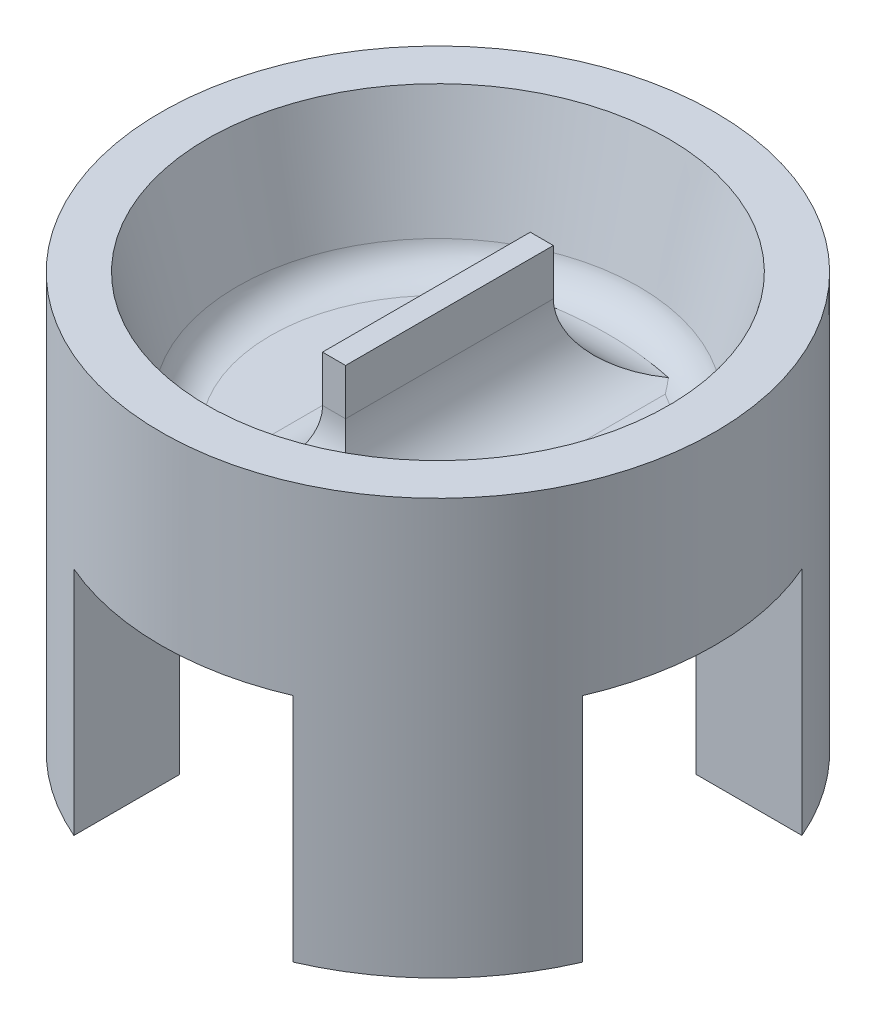
ISO-10303-21;
HEADER;
FILE_DESCRIPTION(('STEP AP214'),'2;1');
FILE_NAME('part.step','',(''),(''),'','','');
FILE_SCHEMA(('AUTOMOTIVE_DESIGN { 1 0 10303 214 1 1 1 1 }'));
ENDSEC;
DATA;
#1=APPLICATION_CONTEXT('core data for automotive mechanical design processes');
#2=APPLICATION_PROTOCOL_DEFINITION('international standard','automotive_design',2000,#1);
#3=PRODUCT_CONTEXT('',#1,'mechanical');
#4=PRODUCT('Part','Part','',(#3));
#5=PRODUCT_RELATED_PRODUCT_CATEGORY('part','',(#4));
#6=PRODUCT_DEFINITION_FORMATION('','',#4);
#7=PRODUCT_DEFINITION_CONTEXT('part definition',#1,'design');
#8=PRODUCT_DEFINITION('design','',#6,#7);
#9=PRODUCT_DEFINITION_SHAPE('','',#8);
#10=(LENGTH_UNIT() NAMED_UNIT(*) SI_UNIT(.MILLI.,.METRE.));
#11=(NAMED_UNIT(*) PLANE_ANGLE_UNIT() SI_UNIT($,.RADIAN.));
#12=(NAMED_UNIT(*) SI_UNIT($,.STERADIAN.) SOLID_ANGLE_UNIT());
#13=UNCERTAINTY_MEASURE_WITH_UNIT(LENGTH_MEASURE(1.E-05),#10,'distance_accuracy_value','');
#14=(GEOMETRIC_REPRESENTATION_CONTEXT(3) GLOBAL_UNCERTAINTY_ASSIGNED_CONTEXT((#13)) GLOBAL_UNIT_ASSIGNED_CONTEXT((#10,
#11,#12)) REPRESENTATION_CONTEXT('',''));
#15=CARTESIAN_POINT('',(0.,0.,0.));
#16=DIRECTION('',(0.,0.,1.));
#17=DIRECTION('',(1.,0.,0.));
#18=AXIS2_PLACEMENT_3D('',#15,#16,#17);
#19=CARTESIAN_POINT('',(0.,1.,0.));
#20=DIRECTION('',(0.,1.,0.));
#21=DIRECTION('',(0.,0.,1.));
#22=AXIS2_PLACEMENT_3D('',#19,#20,#21);
#23=PLANE('',#22);
#24=DIRECTION('',(0.,0.,1.));
#25=VECTOR('',#24,1.);
#26=CARTESIAN_POINT('',(1.75,1.,2.25));
#27=LINE('',#26,#25);
#28=CARTESIAN_POINT('',(1.75,1.,-3.17322598212696));
#29=VERTEX_POINT('',#28);
#30=CARTESIAN_POINT('',(1.75,1.,3.17322598212696));
#31=VERTEX_POINT('',#30);
#32=EDGE_CURVE('E361',#29,#31,#27,.T.);
#33=ORIENTED_EDGE('',*,*,#32,.T.);
#34=CARTESIAN_POINT('',(0.,1.,0.));
#35=DIRECTION('',(0.,1.,0.));
#36=DIRECTION('',(0.,0.,1.));
#37=AXIS2_PLACEMENT_3D('',#34,#35,#36);
#38=CIRCLE('',#37,3.623791265187);
#39=EDGE_CURVE('E389',#31,#29,#38,.T.);
#40=ORIENTED_EDGE('',*,*,#39,.T.);
#41=EDGE_LOOP('',(#33,#40));
#42=FACE_BOUND('',#41,.T.);
#43=ADVANCED_FACE('F39',(#42),#23,.T.);
#44=DIRECTION('',(0.,0.,-1.));
#45=VECTOR('',#44,1.);
#46=CARTESIAN_POINT('',(-1.75,1.,-2.25));
#47=LINE('',#46,#45);
#48=CARTESIAN_POINT('',(-1.75,1.,3.17322598212696));
#49=VERTEX_POINT('',#48);
#50=CARTESIAN_POINT('',(-1.75,1.,-3.17322598212696));
#51=VERTEX_POINT('',#50);
#52=EDGE_CURVE('E364',#49,#51,#47,.T.);
#53=ORIENTED_EDGE('',*,*,#52,.T.);
#54=CARTESIAN_POINT('',(0.,1.,0.));
#55=DIRECTION('',(0.,1.,0.));
#56=DIRECTION('',(0.,0.,1.));
#57=AXIS2_PLACEMENT_3D('',#54,#55,#56);
#58=CIRCLE('',#57,3.623791265187);
#59=EDGE_CURVE('E387',#51,#49,#58,.T.);
#60=ORIENTED_EDGE('',*,*,#59,.T.);
#61=EDGE_LOOP('',(#53,#60));
#62=FACE_BOUND('',#61,.T.);
#63=ADVANCED_FACE('F438',(#62),#23,.T.);
#64=CARTESIAN_POINT('',(0.25,3.5,0.));
#65=DIRECTION('',(1.,0.,0.));
#66=DIRECTION('',(0.,0.,-1.));
#67=AXIS2_PLACEMENT_3D('',#64,#65,#66);
#68=PLANE('',#67);
#69=DIRECTION('',(0.,-1.,0.));
#70=VECTOR('',#69,1.);
#71=CARTESIAN_POINT('',(0.25,3.5,2.25));
#72=LINE('',#71,#70);
#73=CARTESIAN_POINT('',(0.25,3.5,2.25));
#74=VERTEX_POINT('',#73);
#75=CARTESIAN_POINT('',(0.25,2.5,2.25));
#76=VERTEX_POINT('',#75);
#77=EDGE_CURVE('E207',#74,#76,#72,.T.);
#78=ORIENTED_EDGE('',*,*,#77,.T.);
#79=DIRECTION('',(0.,0.,1.));
#80=VECTOR('',#79,1.);
#81=CARTESIAN_POINT('',(0.25,2.5,-2.25));
#82=LINE('',#81,#80);
#83=CARTESIAN_POINT('',(0.25,2.5,-2.25));
#84=VERTEX_POINT('',#83);
#85=EDGE_CURVE('E370',#76,#84,#82,.F.);
#86=ORIENTED_EDGE('',*,*,#85,.T.);
#87=DIRECTION('',(0.,-1.,0.));
#88=VECTOR('',#87,1.);
#89=CARTESIAN_POINT('',(0.25,3.5,-2.25));
#90=LINE('',#89,#88);
#91=CARTESIAN_POINT('',(0.25,3.5,-2.25));
#92=VERTEX_POINT('',#91);
#93=EDGE_CURVE('E233',#92,#84,#90,.T.);
#94=ORIENTED_EDGE('',*,*,#93,.F.);
#95=DIRECTION('',(0.,0.,1.));
#96=VECTOR('',#95,1.);
#97=CARTESIAN_POINT('',(0.25,3.5,0.));
#98=LINE('',#97,#96);
#99=EDGE_CURVE('E226',#92,#74,#98,.T.);
#100=ORIENTED_EDGE('',*,*,#99,.T.);
#101=EDGE_LOOP('',(#78,#86,#94,#100));
#102=FACE_BOUND('',#101,.T.);
#103=ADVANCED_FACE('F231',(#102),#68,.T.);
#104=CARTESIAN_POINT('',(0.,3.5,-2.25));
#105=DIRECTION('',(0.,0.,-1.));
#106=DIRECTION('',(-1.,0.,0.));
#107=AXIS2_PLACEMENT_3D('',#104,#105,#106);
#108=PLANE('',#107);
#109=ORIENTED_EDGE('',*,*,#93,.T.);
#110=DIRECTION('',(1.,0.,0.));
#111=VECTOR('',#110,1.);
#112=CARTESIAN_POINT('',(-1.75,2.5,-2.25));
#113=LINE('',#112,#111);
#114=CARTESIAN_POINT('',(-0.25,2.5,-2.25));
#115=VERTEX_POINT('',#114);
#116=EDGE_CURVE('E372',#84,#115,#113,.F.);
#117=ORIENTED_EDGE('',*,*,#116,.T.);
#118=DIRECTION('',(0.,-1.,0.));
#119=VECTOR('',#118,1.);
#120=CARTESIAN_POINT('',(-0.25,3.5,-2.25));
#121=LINE('',#120,#119);
#122=CARTESIAN_POINT('',(-0.25,3.5,-2.25));
#123=VERTEX_POINT('',#122);
#124=EDGE_CURVE('E245',#123,#115,#121,.T.);
#125=ORIENTED_EDGE('',*,*,#124,.F.);
#126=DIRECTION('',(1.,0.,0.));
#127=VECTOR('',#126,1.);
#128=CARTESIAN_POINT('',(0.,3.5,-2.25));
#129=LINE('',#128,#127);
#130=EDGE_CURVE('E219',#123,#92,#129,.T.);
#131=ORIENTED_EDGE('',*,*,#130,.T.);
#132=EDGE_LOOP('',(#109,#117,#125,#131));
#133=FACE_BOUND('',#132,.T.);
#134=ADVANCED_FACE('F448',(#133),#108,.T.);
#135=CARTESIAN_POINT('',(-0.25,3.5,0.));
#136=DIRECTION('',(-1.,0.,0.));
#137=DIRECTION('',(0.,0.,1.));
#138=AXIS2_PLACEMENT_3D('',#135,#136,#137);
#139=PLANE('',#138);
#140=ORIENTED_EDGE('',*,*,#124,.T.);
#141=DIRECTION('',(0.,0.,-1.));
#142=VECTOR('',#141,1.);
#143=CARTESIAN_POINT('',(-0.25,2.5,2.25));
#144=LINE('',#143,#142);
#145=CARTESIAN_POINT('',(-0.25,2.5,2.25));
#146=VERTEX_POINT('',#145);
#147=EDGE_CURVE('E367',#115,#146,#144,.F.);
#148=ORIENTED_EDGE('',*,*,#147,.T.);
#149=DIRECTION('',(0.,-1.,0.));
#150=VECTOR('',#149,1.);
#151=CARTESIAN_POINT('',(-0.25,3.5,2.25));
#152=LINE('',#151,#150);
#153=CARTESIAN_POINT('',(-0.25,3.5,2.25));
#154=VERTEX_POINT('',#153);
#155=EDGE_CURVE('E218',#154,#146,#152,.T.);
#156=ORIENTED_EDGE('',*,*,#155,.F.);
#157=DIRECTION('',(0.,0.,-1.));
#158=VECTOR('',#157,1.);
#159=CARTESIAN_POINT('',(-0.25,3.5,0.));
#160=LINE('',#159,#158);
#161=EDGE_CURVE('E229',#154,#123,#160,.T.);
#162=ORIENTED_EDGE('',*,*,#161,.T.);
#163=EDGE_LOOP('',(#140,#148,#156,#162));
#164=FACE_BOUND('',#163,.T.);
#165=ADVANCED_FACE('F504',(#164),#139,.T.);
#166=CARTESIAN_POINT('',(0.,3.5,2.25));
#167=DIRECTION('',(0.,0.,1.));
#168=DIRECTION('',(1.,0.,0.));
#169=AXIS2_PLACEMENT_3D('',#166,#167,#168);
#170=PLANE('',#169);
#171=ORIENTED_EDGE('',*,*,#155,.T.);
#172=DIRECTION('',(-1.,0.,0.));
#173=VECTOR('',#172,1.);
#174=CARTESIAN_POINT('',(1.75,2.5,2.25));
#175=LINE('',#174,#173);
#176=EDGE_CURVE('E213',#146,#76,#175,.F.);
#177=ORIENTED_EDGE('',*,*,#176,.T.);
#178=ORIENTED_EDGE('',*,*,#77,.F.);
#179=DIRECTION('',(-1.,0.,0.));
#180=VECTOR('',#179,1.);
#181=CARTESIAN_POINT('',(0.,3.5,2.25));
#182=LINE('',#181,#180);
#183=EDGE_CURVE('E211',#74,#154,#182,.T.);
#184=ORIENTED_EDGE('',*,*,#183,.T.);
#185=EDGE_LOOP('',(#171,#177,#178,#184));
#186=FACE_BOUND('',#185,.T.);
#187=ADVANCED_FACE('F210',(#186),#170,.T.);
#188=CARTESIAN_POINT('',(0.,3.5,0.));
#189=DIRECTION('',(0.,-1.,0.));
#190=DIRECTION('',(0.,0.,-1.));
#191=AXIS2_PLACEMENT_3D('',#188,#189,#190);
#192=PLANE('',#191);
#193=ORIENTED_EDGE('',*,*,#99,.F.);
#194=ORIENTED_EDGE('',*,*,#130,.F.);
#195=ORIENTED_EDGE('',*,*,#161,.F.);
#196=ORIENTED_EDGE('',*,*,#183,.F.);
#197=EDGE_LOOP('',(#193,#194,#195,#196));
#198=FACE_BOUND('',#197,.T.);
#199=ADVANCED_FACE('F224',(#198),#192,.F.);
#200=CARTESIAN_POINT('',(-1.75,2.5,0.));
#201=DIRECTION('',(0.,0.,1.));
#202=DIRECTION('',(1.,0.,0.));
#203=AXIS2_PLACEMENT_3D('',#200,#201,#202);
#204=CYLINDRICAL_SURFACE('',#203,1.5);
#205=CARTESIAN_POINT('',(-1.75,2.5,-3.75));
#206=DIRECTION('',(-0.707106781186547,0.,0.707106781186547));
#207=DIRECTION('',(0.707106781186547,0.,0.707106781186547));
#208=AXIS2_PLACEMENT_3D('',#205,#206,#207);
#209=ELLIPSE('',#208,2.12132034355964,1.5);
#210=CARTESIAN_POINT('',(-1.49605326697927,1.02165259266027,-3.49605326697927));
#211=VERTEX_POINT('',#210);
#212=EDGE_CURVE('E377',#115,#211,#209,.F.);
#213=ORIENTED_EDGE('',*,*,#212,.T.);
#214=CARTESIAN_POINT('',(-1.49605326697927,1.02165259266027,-3.49605326697927));
#215=CARTESIAN_POINT('',(-1.53908933126394,1.01427018335894,-3.44489890433631));
#216=CARTESIAN_POINT('',(-1.58141630981375,1.00892279144213,-3.39287521979692));
#217=CARTESIAN_POINT('',(-1.66443352390068,1.00186198080539,-3.28745021497996));
#218=CARTESIAN_POINT('',(-1.70512666962131,1.00014179139679,-3.23405165013105));
#219=CARTESIAN_POINT('',(-1.74665022550539,1.00000280983622,-3.17777520763984));
#220=CARTESIAN_POINT('',(-1.74832586538904,1.00000000753565,-3.17550112580324));
#221=CARTESIAN_POINT('',(-1.75,1.,-3.17322598212696));
#222=B_SPLINE_CURVE_WITH_KNOTS('',3,(#214,#215,#216,#217,#218,#219,#220,#221),.UNSPECIFIED.,.F.,
.F.,(4,2,2,4),(0.,0.201712666102183,0.403048472327065,0.411522718053596),.UNSPECIFIED.);
#223=EDGE_CURVE('E52',#211,#51,#222,.T.);
#224=ORIENTED_EDGE('',*,*,#223,.T.);
#225=ORIENTED_EDGE('',*,*,#52,.F.);
#226=CARTESIAN_POINT('',(-1.49605326697927,1.02165259266027,3.49605326697927));
#227=CARTESIAN_POINT('',(-1.53908933126391,1.01427018335894,3.44489890433629));
#228=CARTESIAN_POINT('',(-1.58141630981374,1.00892279144214,3.39287521979691));
#229=CARTESIAN_POINT('',(-1.6644335239007,1.00186198080539,3.28745021497997));
#230=CARTESIAN_POINT('',(-1.70512666962134,1.00014179139679,3.23405165013107));
#231=CARTESIAN_POINT('',(-1.74665022550539,1.00000280983622,3.17777520763984));
#232=CARTESIAN_POINT('',(-1.74832586538904,1.00000000753565,3.17550112580324));
#233=CARTESIAN_POINT('',(-1.75,1.,3.17322598212696));
#234=B_SPLINE_CURVE_WITH_KNOTS('',3,(#226,#227,#228,#229,#230,#231,#232,#233),.UNSPECIFIED.,.F.,
.F.,(4,2,2,4),(0.,0.201712666102185,0.403048472327064,0.411522718053597),.UNSPECIFIED.);
#235=CARTESIAN_POINT('',(-1.49605326697927,1.02165259266027,3.49605326697927));
#236=VERTEX_POINT('',#235);
#237=EDGE_CURVE('E59',#49,#236,#234,.F.);
#238=ORIENTED_EDGE('',*,*,#237,.T.);
#239=CARTESIAN_POINT('',(-1.75,2.5,3.75));
#240=DIRECTION('',(0.707106781186547,0.,0.707106781186547));
#241=DIRECTION('',(-0.707106781186547,0.,0.707106781186547));
#242=AXIS2_PLACEMENT_3D('',#239,#240,#241);
#243=ELLIPSE('',#242,2.12132034355964,1.5);
#244=EDGE_CURVE('E379',#236,#146,#243,.T.);
#245=ORIENTED_EDGE('',*,*,#244,.T.);
#246=ORIENTED_EDGE('',*,*,#147,.F.);
#247=EDGE_LOOP('',(#213,#224,#225,#238,#245,#246));
#248=FACE_BOUND('',#247,.T.);
#249=ADVANCED_FACE('F411',(#248),#204,.F.);
#250=CARTESIAN_POINT('',(1.75,2.5,0.));
#251=DIRECTION('',(0.,0.,-1.));
#252=DIRECTION('',(-1.,0.,0.));
#253=AXIS2_PLACEMENT_3D('',#250,#251,#252);
#254=CYLINDRICAL_SURFACE('',#253,1.5);
#255=ORIENTED_EDGE('',*,*,#32,.F.);
#256=CARTESIAN_POINT('',(1.49605326697927,1.02165259266027,-3.49605326697927));
#257=CARTESIAN_POINT('',(1.53908933126391,1.01427018335894,-3.44489890433629));
#258=CARTESIAN_POINT('',(1.58141630981374,1.00892279144214,-3.39287521979691));
#259=CARTESIAN_POINT('',(1.6644335239007,1.00186198080539,-3.28745021497997));
#260=CARTESIAN_POINT('',(1.70512666962134,1.00014179139679,-3.23405165013107));
#261=CARTESIAN_POINT('',(1.74665022550539,1.00000280983622,-3.17777520763984));
#262=CARTESIAN_POINT('',(1.74832586538904,1.00000000753565,-3.17550112580324));
#263=CARTESIAN_POINT('',(1.75,1.,-3.17322598212696));
#264=B_SPLINE_CURVE_WITH_KNOTS('',3,(#256,#257,#258,#259,#260,#261,#262,#263),.UNSPECIFIED.,.F.,
.F.,(4,2,2,4),(0.,0.201712666102185,0.403048472327064,0.411522718053597),.UNSPECIFIED.);
#265=CARTESIAN_POINT('',(1.49605326697927,1.02165259266027,-3.49605326697927));
#266=VERTEX_POINT('',#265);
#267=EDGE_CURVE('E399',#29,#266,#264,.F.);
#268=ORIENTED_EDGE('',*,*,#267,.T.);
#269=CARTESIAN_POINT('',(1.75,2.5,-3.75));
#270=DIRECTION('',(-0.707106781186547,0.,-0.707106781186547));
#271=DIRECTION('',(0.707106781186547,0.,-0.707106781186547));
#272=AXIS2_PLACEMENT_3D('',#269,#270,#271);
#273=ELLIPSE('',#272,2.12132034355964,1.5);
#274=EDGE_CURVE('E375',#266,#84,#273,.T.);
#275=ORIENTED_EDGE('',*,*,#274,.T.);
#276=ORIENTED_EDGE('',*,*,#85,.F.);
#277=CARTESIAN_POINT('',(1.75,2.5,3.75));
#278=DIRECTION('',(0.707106781186547,0.,-0.707106781186547));
#279=DIRECTION('',(-0.707106781186547,0.,-0.707106781186547));
#280=AXIS2_PLACEMENT_3D('',#277,#278,#279);
#281=ELLIPSE('',#280,2.12132034355964,1.5);
#282=CARTESIAN_POINT('',(1.49605326697927,1.02165259266027,3.49605326697927));
#283=VERTEX_POINT('',#282);
#284=EDGE_CURVE('E381',#76,#283,#281,.F.);
#285=ORIENTED_EDGE('',*,*,#284,.T.);
#286=CARTESIAN_POINT('',(1.49605326697927,1.02165259266027,3.49605326697927));
#287=CARTESIAN_POINT('',(1.53908933126394,1.01427018335894,3.44489890433631));
#288=CARTESIAN_POINT('',(1.58141630981375,1.00892279144213,3.39287521979692));
#289=CARTESIAN_POINT('',(1.66443352390068,1.00186198080539,3.28745021497996));
#290=CARTESIAN_POINT('',(1.70512666962131,1.00014179139679,3.23405165013105));
#291=CARTESIAN_POINT('',(1.74665022550539,1.00000280983622,3.17777520763984));
#292=CARTESIAN_POINT('',(1.74832586538904,1.00000000753565,3.17550112580324));
#293=CARTESIAN_POINT('',(1.75,1.,3.17322598212696));
#294=B_SPLINE_CURVE_WITH_KNOTS('',3,(#286,#287,#288,#289,#290,#291,#292,#293),.UNSPECIFIED.,.F.,
.F.,(4,2,2,4),(0.,0.201712666102183,0.403048472327065,0.411522718053596),.UNSPECIFIED.);
#295=EDGE_CURVE('E392',#283,#31,#294,.T.);
#296=ORIENTED_EDGE('',*,*,#295,.T.);
#297=EDGE_LOOP('',(#255,#268,#275,#276,#285,#296));
#298=FACE_BOUND('',#297,.T.);
#299=ADVANCED_FACE('F405',(#298),#254,.F.);
#300=CARTESIAN_POINT('',(0.,2.5,-3.75));
#301=DIRECTION('',(-1.,0.,0.));
#302=DIRECTION('',(0.,0.,1.));
#303=AXIS2_PLACEMENT_3D('',#300,#301,#302);
#304=CYLINDRICAL_SURFACE('',#303,1.5);
#305=ORIENTED_EDGE('',*,*,#274,.F.);
#306=CARTESIAN_POINT('',(1.49605326697927,1.02165259266027,-3.49605326697927));
#307=CARTESIAN_POINT('',(1.3827723803451,1.01696830888682,-3.523589809499));
#308=CARTESIAN_POINT('',(1.26869917591475,1.01351420898775,-3.54804714692911));
#309=CARTESIAN_POINT('',(1.03939449670008,1.00831875589812,-3.5906758400532));
#310=CARTESIAN_POINT('',(0.924163535937596,1.00657667384445,-3.60884986862348));
#311=CARTESIAN_POINT('',(0.712920486420398,1.00427350203379,-3.63621130607991));
#312=CARTESIAN_POINT('',(0.617039660709062,1.00356003336105,-3.64641042982602));
#313=CARTESIAN_POINT('',(0.424892615545098,1.00253839937794,-3.66240011999431));
#314=CARTESIAN_POINT('',(0.328626325430665,1.00223031214573,-3.6681898370558));
#315=CARTESIAN_POINT('',(0.0874112928485685,1.00175882994414,-3.67712324169602));
#316=CARTESIAN_POINT('',(-0.0576509521793053,1.0017463294534,-3.67746804371406));
#317=CARTESIAN_POINT('',(-0.34749736383111,1.00223076941073,-3.66810795105502));
#318=CARTESIAN_POINT('',(-0.492281390274639,1.00272792101619,-3.65839889087778));
#319=CARTESIAN_POINT('',(-0.781336826327782,1.00481632883575,-3.62897796421589));
#320=CARTESIAN_POINT('',(-0.925604806420446,1.00641130866059,-3.60923211477089));
#321=CARTESIAN_POINT('',(-1.14065906515106,1.01051765185565,-3.57225786607192));
#322=CARTESIAN_POINT('',(-1.21211205850882,1.01217182518419,-3.558708941944));
#323=CARTESIAN_POINT('',(-1.35449540549986,1.0162675793777,-3.52918958090675));
#324=CARTESIAN_POINT('',(-1.42542574239033,1.01870918535617,-3.51321906677454));
#325=CARTESIAN_POINT('',(-1.49605326697927,1.02165259266027,-3.49605326697927));
#326=B_SPLINE_CURVE_WITH_KNOTS('',3,(#306,#307,#308,#309,#310,#311,#312,#313,#314,#315,#316,
#317,#318,#319,#320,#321,#322,#323,#324,#325),.UNSPECIFIED.,.F.,.F.,(4,2,2,2,2,2,2,2,2,4),(0.,
0.349964486039017,0.699779915890079,0.988952504155252,1.27818078012857,1.71299609600624,
2.14799163598045,2.58446991050861,2.8026650244955,3.0208670980412),.UNSPECIFIED.);
#327=EDGE_CURVE('E67',#266,#211,#326,.T.);
#328=ORIENTED_EDGE('',*,*,#327,.T.);
#329=ORIENTED_EDGE('',*,*,#212,.F.);
#330=ORIENTED_EDGE('',*,*,#116,.F.);
#331=EDGE_LOOP('',(#305,#328,#329,#330));
#332=FACE_BOUND('',#331,.T.);
#333=ADVANCED_FACE('F410',(#332),#304,.F.);
#334=CARTESIAN_POINT('',(0.,2.5,3.75));
#335=DIRECTION('',(1.,0.,0.));
#336=DIRECTION('',(0.,0.,-1.));
#337=AXIS2_PLACEMENT_3D('',#334,#335,#336);
#338=CYLINDRICAL_SURFACE('',#337,1.5);
#339=ORIENTED_EDGE('',*,*,#244,.F.);
#340=CARTESIAN_POINT('',(-1.49605326697927,1.02165259266027,3.49605326697927));
#341=CARTESIAN_POINT('',(-1.3827723803451,1.01696830888682,3.523589809499));
#342=CARTESIAN_POINT('',(-1.26869917591475,1.01351420898775,3.54804714692911));
#343=CARTESIAN_POINT('',(-1.03939449670008,1.00831875589812,3.5906758400532));
#344=CARTESIAN_POINT('',(-0.924163535937596,1.00657667384445,3.60884986862348));
#345=CARTESIAN_POINT('',(-0.712920486420398,1.00427350203379,3.63621130607991));
#346=CARTESIAN_POINT('',(-0.617039660709062,1.00356003336105,3.64641042982602));
#347=CARTESIAN_POINT('',(-0.424892615545098,1.00253839937794,3.66240011999431));
#348=CARTESIAN_POINT('',(-0.328626325430665,1.00223031214573,3.6681898370558));
#349=CARTESIAN_POINT('',(-0.0874112928485685,1.00175882994414,3.67712324169602));
#350=CARTESIAN_POINT('',(0.0576509521793053,1.0017463294534,3.67746804371406));
#351=CARTESIAN_POINT('',(0.34749736383111,1.00223076941073,3.66810795105502));
#352=CARTESIAN_POINT('',(0.492281390274639,1.00272792101619,3.65839889087778));
#353=CARTESIAN_POINT('',(0.781336826327782,1.00481632883575,3.62897796421589));
#354=CARTESIAN_POINT('',(0.925604806420446,1.00641130866059,3.60923211477089));
#355=CARTESIAN_POINT('',(1.14065906515106,1.01051765185565,3.57225786607192));
#356=CARTESIAN_POINT('',(1.21211205850882,1.01217182518419,3.558708941944));
#357=CARTESIAN_POINT('',(1.35449540549986,1.0162675793777,3.52918958090675));
#358=CARTESIAN_POINT('',(1.42542574239033,1.01870918535617,3.51321906677454));
#359=CARTESIAN_POINT('',(1.49605326697927,1.02165259266027,3.49605326697927));
#360=B_SPLINE_CURVE_WITH_KNOTS('',3,(#340,#341,#342,#343,#344,#345,#346,#347,#348,#349,#350,
#351,#352,#353,#354,#355,#356,#357,#358,#359),.UNSPECIFIED.,.F.,.F.,(4,2,2,2,2,2,2,2,2,4),(0.,
0.349964486039017,0.699779915890079,0.988952504155252,1.27818078012857,1.71299609600624,
2.14799163598045,2.58446991050861,2.8026650244955,3.0208670980412),.UNSPECIFIED.);
#361=EDGE_CURVE('E11',#236,#283,#360,.T.);
#362=ORIENTED_EDGE('',*,*,#361,.T.);
#363=ORIENTED_EDGE('',*,*,#284,.F.);
#364=ORIENTED_EDGE('',*,*,#176,.F.);
#365=EDGE_LOOP('',(#339,#362,#363,#364));
#366=FACE_BOUND('',#365,.T.);
#367=ADVANCED_FACE('F418',(#366),#338,.F.);
#368=CARTESIAN_POINT('',(0.,4.,6.));
#369=DIRECTION('',(0.,-1.,0.));
#370=DIRECTION('',(0.,0.,-1.));
#371=AXIS2_PLACEMENT_3D('',#368,#369,#370);
#372=PLANE('',#371);
#373=CARTESIAN_POINT('',(0.,4.,0.));
#374=DIRECTION('',(0.,-1.,0.));
#375=DIRECTION('',(0.,0.,-1.));
#376=AXIS2_PLACEMENT_3D('',#373,#374,#375);
#377=CIRCLE('',#376,6.);
#378=CARTESIAN_POINT('',(0.,4.,-6.));
#379=VERTEX_POINT('',#378);
#380=EDGE_CURVE('E234',#379,#379,#377,.T.);
#381=ORIENTED_EDGE('',*,*,#380,.F.);
#382=EDGE_LOOP('',(#381));
#383=FACE_BOUND('',#382,.T.);
#384=CARTESIAN_POINT('',(0.,4.,0.));
#385=DIRECTION('',(0.,-1.,0.));
#386=DIRECTION('',(0.,0.,-1.));
#387=AXIS2_PLACEMENT_3D('',#384,#385,#386);
#388=CIRCLE('',#387,5.);
#389=CARTESIAN_POINT('',(0.,4.,-5.));
#390=VERTEX_POINT('',#389);
#391=EDGE_CURVE('E237',#390,#390,#388,.T.);
#392=ORIENTED_EDGE('',*,*,#391,.T.);
#393=EDGE_LOOP('',(#392));
#394=FACE_BOUND('',#393,.T.);
#395=ADVANCED_FACE('F484',(#383,#394),#372,.F.);
#396=CARTESIAN_POINT('',(0.,1.,0.));
#397=DIRECTION('',(0.,1.,0.));
#398=DIRECTION('',(0.,0.,1.));
#399=AXIS2_PLACEMENT_3D('',#396,#397,#398);
#400=CONICAL_SURFACE('',#399,4.2,0.260602391747341);
#401=CARTESIAN_POINT('',(0.,1.55675301207975,0.));
#402=DIRECTION('',(0.,-1.,0.));
#403=DIRECTION('',(0.,0.,-1.));
#404=AXIS2_PLACEMENT_3D('',#401,#402,#403);
#405=CIRCLE('',#404,4.34846746988793);
#406=CARTESIAN_POINT('',(0.,1.55675301207975,-4.34846746988793));
#407=VERTEX_POINT('',#406);
#408=EDGE_CURVE('E384',#407,#407,#405,.T.);
#409=ORIENTED_EDGE('',*,*,#408,.T.);
#410=EDGE_LOOP('',(#409));
#411=FACE_BOUND('',#410,.T.);
#412=ORIENTED_EDGE('',*,*,#391,.F.);
#413=EDGE_LOOP('',(#412));
#414=FACE_BOUND('',#413,.T.);
#415=ADVANCED_FACE('F487',(#411,#414),#400,.F.);
#416=CARTESIAN_POINT('',(0.,-15.,0.));
#417=DIRECTION('',(0.,1.,0.));
#418=DIRECTION('',(0.,0.,1.));
#419=AXIS2_PLACEMENT_3D('',#416,#417,#418);
#420=CYLINDRICAL_SURFACE('',#419,4.);
#421=DIRECTION('',(0.,1.,0.));
#422=VECTOR('',#421,1.);
#423=CARTESIAN_POINT('',(2.375,-15.,3.21859829739593));
#424=LINE('',#423,#422);
#425=CARTESIAN_POINT('',(2.375,-5.,3.21859829739593));
#426=VERTEX_POINT('',#425);
#427=CARTESIAN_POINT('',(2.375,0.,3.21859829739593));
#428=VERTEX_POINT('',#427);
#429=EDGE_CURVE('E285',#426,#428,#424,.T.);
#430=ORIENTED_EDGE('',*,*,#429,.T.);
#431=CARTESIAN_POINT('',(0.,0.,0.));
#432=DIRECTION('',(0.,1.,0.));
#433=DIRECTION('',(0.,0.,1.));
#434=AXIS2_PLACEMENT_3D('',#431,#432,#433);
#435=CIRCLE('',#434,4.);
#436=CARTESIAN_POINT('',(3.21859829739593,0.,2.375));
#437=VERTEX_POINT('',#436);
#438=EDGE_CURVE('E244',#428,#437,#435,.T.);
#439=ORIENTED_EDGE('',*,*,#438,.T.);
#440=DIRECTION('',(0.,1.,0.));
#441=VECTOR('',#440,1.);
#442=CARTESIAN_POINT('',(3.21859829739593,-15.,2.375));
#443=LINE('',#442,#441);
#444=CARTESIAN_POINT('',(3.21859829739593,-5.,2.375));
#445=VERTEX_POINT('',#444);
#446=EDGE_CURVE('E284',#445,#437,#443,.T.);
#447=ORIENTED_EDGE('',*,*,#446,.F.);
#448=CARTESIAN_POINT('',(0.,-5.,0.));
#449=DIRECTION('',(0.,1.,0.));
#450=DIRECTION('',(0.,0.,1.));
#451=AXIS2_PLACEMENT_3D('',#448,#449,#450);
#452=CIRCLE('',#451,4.);
#453=EDGE_CURVE('E324',#426,#445,#452,.T.);
#454=ORIENTED_EDGE('',*,*,#453,.F.);
#455=EDGE_LOOP('',(#430,#439,#447,#454));
#456=FACE_BOUND('',#455,.T.);
#457=ADVANCED_FACE('F458',(#456),#420,.F.);
#458=CARTESIAN_POINT('',(0.,-15.,0.));
#459=DIRECTION('',(0.,1.,0.));
#460=DIRECTION('',(0.,0.,1.));
#461=AXIS2_PLACEMENT_3D('',#458,#459,#460);
#462=CYLINDRICAL_SURFACE('',#461,4.);
#463=DIRECTION('',(0.,1.,0.));
#464=VECTOR('',#463,1.);
#465=CARTESIAN_POINT('',(3.21859829739593,-15.,-2.375));
#466=LINE('',#465,#464);
#467=CARTESIAN_POINT('',(3.21859829739593,-5.,-2.375));
#468=VERTEX_POINT('',#467);
#469=CARTESIAN_POINT('',(3.21859829739593,0.,-2.375));
#470=VERTEX_POINT('',#469);
#471=EDGE_CURVE('E298',#468,#470,#466,.T.);
#472=ORIENTED_EDGE('',*,*,#471,.T.);
#473=CARTESIAN_POINT('',(0.,0.,0.));
#474=DIRECTION('',(0.,1.,0.));
#475=DIRECTION('',(0.,0.,1.));
#476=AXIS2_PLACEMENT_3D('',#473,#474,#475);
#477=CIRCLE('',#476,4.);
#478=CARTESIAN_POINT('',(2.375,0.,-3.21859829739593));
#479=VERTEX_POINT('',#478);
#480=EDGE_CURVE('E257',#470,#479,#477,.T.);
#481=ORIENTED_EDGE('',*,*,#480,.T.);
#482=DIRECTION('',(0.,1.,0.));
#483=VECTOR('',#482,1.);
#484=CARTESIAN_POINT('',(2.375,-15.,-3.21859829739593));
#485=LINE('',#484,#483);
#486=CARTESIAN_POINT('',(2.375,-5.,-3.21859829739593));
#487=VERTEX_POINT('',#486);
#488=EDGE_CURVE('E296',#487,#479,#485,.T.);
#489=ORIENTED_EDGE('',*,*,#488,.F.);
#490=CARTESIAN_POINT('',(0.,-5.,0.));
#491=DIRECTION('',(0.,1.,0.));
#492=DIRECTION('',(0.,0.,1.));
#493=AXIS2_PLACEMENT_3D('',#490,#491,#492);
#494=CIRCLE('',#493,4.);
#495=EDGE_CURVE('E333',#468,#487,#494,.T.);
#496=ORIENTED_EDGE('',*,*,#495,.F.);
#497=EDGE_LOOP('',(#472,#481,#489,#496));
#498=FACE_BOUND('',#497,.T.);
#499=ADVANCED_FACE('F497',(#498),#462,.F.);
#500=CARTESIAN_POINT('',(0.,-15.,0.));
#501=DIRECTION('',(0.,1.,0.));
#502=DIRECTION('',(0.,0.,1.));
#503=AXIS2_PLACEMENT_3D('',#500,#501,#502);
#504=CYLINDRICAL_SURFACE('',#503,4.);
#505=DIRECTION('',(0.,1.,0.));
#506=VECTOR('',#505,1.);
#507=CARTESIAN_POINT('',(-2.375,-15.,-3.21859829739593));
#508=LINE('',#507,#506);
#509=CARTESIAN_POINT('',(-2.375,-5.,-3.21859829739593));
#510=VERTEX_POINT('',#509);
#511=CARTESIAN_POINT('',(-2.375,0.,-3.21859829739593));
#512=VERTEX_POINT('',#511);
#513=EDGE_CURVE('E294',#510,#512,#508,.T.);
#514=ORIENTED_EDGE('',*,*,#513,.T.);
#515=CARTESIAN_POINT('',(0.,0.,0.));
#516=DIRECTION('',(0.,1.,0.));
#517=DIRECTION('',(0.,0.,1.));
#518=AXIS2_PLACEMENT_3D('',#515,#516,#517);
#519=CIRCLE('',#518,4.);
#520=CARTESIAN_POINT('',(-3.21859829739593,0.,-2.375));
#521=VERTEX_POINT('',#520);
#522=EDGE_CURVE('E266',#512,#521,#519,.T.);
#523=ORIENTED_EDGE('',*,*,#522,.T.);
#524=DIRECTION('',(0.,1.,0.));
#525=VECTOR('',#524,1.);
#526=CARTESIAN_POINT('',(-3.21859829739593,-15.,-2.375));
#527=LINE('',#526,#525);
#528=CARTESIAN_POINT('',(-3.21859829739593,-5.,-2.375));
#529=VERTEX_POINT('',#528);
#530=EDGE_CURVE('E292',#529,#521,#527,.T.);
#531=ORIENTED_EDGE('',*,*,#530,.F.);
#532=CARTESIAN_POINT('',(0.,-5.,0.));
#533=DIRECTION('',(0.,1.,0.));
#534=DIRECTION('',(0.,0.,1.));
#535=AXIS2_PLACEMENT_3D('',#532,#533,#534);
#536=CIRCLE('',#535,4.);
#537=EDGE_CURVE('E342',#510,#529,#536,.T.);
#538=ORIENTED_EDGE('',*,*,#537,.F.);
#539=EDGE_LOOP('',(#514,#523,#531,#538));
#540=FACE_BOUND('',#539,.T.);
#541=ADVANCED_FACE('F526',(#540),#504,.F.);
#542=CARTESIAN_POINT('',(0.,-15.,0.));
#543=DIRECTION('',(0.,1.,0.));
#544=DIRECTION('',(0.,0.,1.));
#545=AXIS2_PLACEMENT_3D('',#542,#543,#544);
#546=CYLINDRICAL_SURFACE('',#545,4.);
#547=DIRECTION('',(0.,1.,0.));
#548=VECTOR('',#547,1.);
#549=CARTESIAN_POINT('',(-3.21859829739593,-15.,2.375));
#550=LINE('',#549,#548);
#551=CARTESIAN_POINT('',(-3.21859829739593,-5.,2.375));
#552=VERTEX_POINT('',#551);
#553=CARTESIAN_POINT('',(-3.21859829739593,0.,2.375));
#554=VERTEX_POINT('',#553);
#555=EDGE_CURVE('E290',#552,#554,#550,.T.);
#556=ORIENTED_EDGE('',*,*,#555,.T.);
#557=CARTESIAN_POINT('',(0.,0.,0.));
#558=DIRECTION('',(0.,1.,0.));
#559=DIRECTION('',(0.,0.,1.));
#560=AXIS2_PLACEMENT_3D('',#557,#558,#559);
#561=CIRCLE('',#560,4.);
#562=CARTESIAN_POINT('',(-2.375,0.,3.21859829739593));
#563=VERTEX_POINT('',#562);
#564=EDGE_CURVE('E275',#554,#563,#561,.T.);
#565=ORIENTED_EDGE('',*,*,#564,.T.);
#566=DIRECTION('',(0.,1.,0.));
#567=VECTOR('',#566,1.);
#568=CARTESIAN_POINT('',(-2.375,-15.,3.21859829739593));
#569=LINE('',#568,#567);
#570=CARTESIAN_POINT('',(-2.375,-5.,3.21859829739593));
#571=VERTEX_POINT('',#570);
#572=EDGE_CURVE('E288',#571,#563,#569,.T.);
#573=ORIENTED_EDGE('',*,*,#572,.F.);
#574=CARTESIAN_POINT('',(0.,-5.,0.));
#575=DIRECTION('',(0.,1.,0.));
#576=DIRECTION('',(0.,0.,1.));
#577=AXIS2_PLACEMENT_3D('',#574,#575,#576);
#578=CIRCLE('',#577,4.);
#579=EDGE_CURVE('E351',#552,#571,#578,.T.);
#580=ORIENTED_EDGE('',*,*,#579,.F.);
#581=EDGE_LOOP('',(#556,#565,#573,#580));
#582=FACE_BOUND('',#581,.T.);
#583=ADVANCED_FACE('F523',(#582),#546,.F.);
#584=CARTESIAN_POINT('',(-10.,-15.,-2.375));
#585=DIRECTION('',(0.,0.,-1.));
#586=DIRECTION('',(-1.,0.,0.));
#587=AXIS2_PLACEMENT_3D('',#584,#585,#586);
#588=PLANE('',#587);
#589=DIRECTION('',(0.,1.,0.));
#590=VECTOR('',#589,1.);
#591=CARTESIAN_POINT('',(-5.50993421013355,-5.,-2.375));
#592=LINE('',#591,#590);
#593=CARTESIAN_POINT('',(-5.50993421013355,0.,-2.375));
#594=VERTEX_POINT('',#593);
#595=CARTESIAN_POINT('',(-5.50993421013355,-5.,-2.375));
#596=VERTEX_POINT('',#595);
#597=EDGE_CURVE('E308',#594,#596,#592,.F.);
#598=ORIENTED_EDGE('',*,*,#597,.T.);
#599=DIRECTION('',(-1.,0.,0.));
#600=VECTOR('',#599,1.);
#601=CARTESIAN_POINT('',(0.,-5.,-2.375));
#602=LINE('',#601,#600);
#603=EDGE_CURVE('E345',#529,#596,#602,.T.);
#604=ORIENTED_EDGE('',*,*,#603,.F.);
#605=ORIENTED_EDGE('',*,*,#530,.T.);
#606=DIRECTION('',(-1.,0.,0.));
#607=VECTOR('',#606,1.);
#608=CARTESIAN_POINT('',(-10.,0.,-2.375));
#609=LINE('',#608,#607);
#610=EDGE_CURVE('E269',#521,#594,#609,.T.);
#611=ORIENTED_EDGE('',*,*,#610,.T.);
#612=EDGE_LOOP('',(#598,#604,#605,#611));
#613=FACE_BOUND('',#612,.T.);
#614=ADVANCED_FACE('F525',(#613),#588,.F.);
#615=CARTESIAN_POINT('',(0.,-5.,0.));
#616=DIRECTION('',(0.,1.,0.));
#617=DIRECTION('',(0.,0.,1.));
#618=AXIS2_PLACEMENT_3D('',#615,#616,#617);
#619=PLANE('',#618);
#620=ORIENTED_EDGE('',*,*,#537,.T.);
#621=ORIENTED_EDGE('',*,*,#603,.T.);
#622=CARTESIAN_POINT('',(0.,-5.,0.));
#623=DIRECTION('',(0.,1.,0.));
#624=DIRECTION('',(0.,0.,1.));
#625=AXIS2_PLACEMENT_3D('',#622,#623,#624);
#626=CIRCLE('',#625,6.);
#627=CARTESIAN_POINT('',(-2.375,-5.,-5.50993421013355));
#628=VERTEX_POINT('',#627);
#629=EDGE_CURVE('E582',#628,#596,#626,.T.);
#630=ORIENTED_EDGE('',*,*,#629,.F.);
#631=DIRECTION('',(0.,0.,1.));
#632=VECTOR('',#631,1.);
#633=CARTESIAN_POINT('',(-2.375,-5.,0.));
#634=LINE('',#633,#632);
#635=EDGE_CURVE('E339',#628,#510,#634,.T.);
#636=ORIENTED_EDGE('',*,*,#635,.T.);
#637=EDGE_LOOP('',(#620,#621,#630,#636));
#638=FACE_BOUND('',#637,.T.);
#639=ADVANCED_FACE('F531',(#638),#619,.F.);
#640=CARTESIAN_POINT('',(-2.375,-15.,-10.));
#641=DIRECTION('',(-1.,0.,0.));
#642=DIRECTION('',(0.,0.,1.));
#643=AXIS2_PLACEMENT_3D('',#640,#641,#642);
#644=PLANE('',#643);
#645=DIRECTION('',(0.,1.,0.));
#646=VECTOR('',#645,1.);
#647=CARTESIAN_POINT('',(-2.375,-5.,-5.50993421013355));
#648=LINE('',#647,#646);
#649=CARTESIAN_POINT('',(-2.375,0.,-5.50993421013355));
#650=VERTEX_POINT('',#649);
#651=EDGE_CURVE('E306',#628,#650,#648,.T.);
#652=ORIENTED_EDGE('',*,*,#651,.T.);
#653=DIRECTION('',(0.,0.,1.));
#654=VECTOR('',#653,1.);
#655=CARTESIAN_POINT('',(-2.375,0.,-10.));
#656=LINE('',#655,#654);
#657=EDGE_CURVE('E263',#650,#512,#656,.T.);
#658=ORIENTED_EDGE('',*,*,#657,.T.);
#659=ORIENTED_EDGE('',*,*,#513,.F.);
#660=ORIENTED_EDGE('',*,*,#635,.F.);
#661=EDGE_LOOP('',(#652,#658,#659,#660));
#662=FACE_BOUND('',#661,.T.);
#663=ADVANCED_FACE('F536',(#662),#644,.F.);
#664=CARTESIAN_POINT('',(2.375,-15.,-10.));
#665=DIRECTION('',(1.,0.,0.));
#666=DIRECTION('',(0.,0.,-1.));
#667=AXIS2_PLACEMENT_3D('',#664,#665,#666);
#668=PLANE('',#667);
#669=DIRECTION('',(0.,1.,0.));
#670=VECTOR('',#669,1.);
#671=CARTESIAN_POINT('',(2.375,-5.,-5.50993421013355));
#672=LINE('',#671,#670);
#673=CARTESIAN_POINT('',(2.375,0.,-5.50993421013355));
#674=VERTEX_POINT('',#673);
#675=CARTESIAN_POINT('',(2.375,-5.,-5.50993421013355));
#676=VERTEX_POINT('',#675);
#677=EDGE_CURVE('E304',#674,#676,#672,.F.);
#678=ORIENTED_EDGE('',*,*,#677,.T.);
#679=DIRECTION('',(0.,0.,-1.));
#680=VECTOR('',#679,1.);
#681=CARTESIAN_POINT('',(2.375,-5.,0.));
#682=LINE('',#681,#680);
#683=EDGE_CURVE('E336',#487,#676,#682,.T.);
#684=ORIENTED_EDGE('',*,*,#683,.F.);
#685=ORIENTED_EDGE('',*,*,#488,.T.);
#686=DIRECTION('',(0.,0.,-1.));
#687=VECTOR('',#686,1.);
#688=CARTESIAN_POINT('',(2.375,0.,-10.));
#689=LINE('',#688,#687);
#690=EDGE_CURVE('E260',#479,#674,#689,.T.);
#691=ORIENTED_EDGE('',*,*,#690,.T.);
#692=EDGE_LOOP('',(#678,#684,#685,#691));
#693=FACE_BOUND('',#692,.T.);
#694=ADVANCED_FACE('F539',(#693),#668,.F.);
#695=ORIENTED_EDGE('',*,*,#495,.T.);
#696=ORIENTED_EDGE('',*,*,#683,.T.);
#697=CARTESIAN_POINT('',(5.50993421013355,-5.,-2.375));
#698=VERTEX_POINT('',#697);
#699=EDGE_CURVE('E321',#698,#676,#626,.T.);
#700=ORIENTED_EDGE('',*,*,#699,.F.);
#701=DIRECTION('',(-1.,0.,0.));
#702=VECTOR('',#701,1.);
#703=CARTESIAN_POINT('',(0.,-5.,-2.375));
#704=LINE('',#703,#702);
#705=EDGE_CURVE('E330',#698,#468,#704,.T.);
#706=ORIENTED_EDGE('',*,*,#705,.T.);
#707=EDGE_LOOP('',(#695,#696,#700,#706));
#708=FACE_BOUND('',#707,.T.);
#709=ADVANCED_FACE('F466',(#708),#619,.F.);
#710=CARTESIAN_POINT('',(3.21859829739593,-15.,-2.375));
#711=DIRECTION('',(0.,0.,-1.));
#712=DIRECTION('',(-1.,0.,0.));
#713=AXIS2_PLACEMENT_3D('',#710,#711,#712);
#714=PLANE('',#713);
#715=DIRECTION('',(0.,1.,0.));
#716=VECTOR('',#715,1.);
#717=CARTESIAN_POINT('',(5.50993421013355,-5.,-2.375));
#718=LINE('',#717,#716);
#719=CARTESIAN_POINT('',(5.50993421013355,0.,-2.375));
#720=VERTEX_POINT('',#719);
#721=EDGE_CURVE('E302',#698,#720,#718,.T.);
#722=ORIENTED_EDGE('',*,*,#721,.T.);
#723=DIRECTION('',(-1.,0.,0.));
#724=VECTOR('',#723,1.);
#725=CARTESIAN_POINT('',(3.21859829739593,0.,-2.375));
#726=LINE('',#725,#724);
#727=EDGE_CURVE('E254',#720,#470,#726,.T.);
#728=ORIENTED_EDGE('',*,*,#727,.T.);
#729=ORIENTED_EDGE('',*,*,#471,.F.);
#730=ORIENTED_EDGE('',*,*,#705,.F.);
#731=EDGE_LOOP('',(#722,#728,#729,#730));
#732=FACE_BOUND('',#731,.T.);
#733=ADVANCED_FACE('F547',(#732),#714,.F.);
#734=CARTESIAN_POINT('',(3.21859829739593,-15.,2.375));
#735=DIRECTION('',(0.,0.,1.));
#736=DIRECTION('',(1.,0.,0.));
#737=AXIS2_PLACEMENT_3D('',#734,#735,#736);
#738=PLANE('',#737);
#739=DIRECTION('',(0.,1.,0.));
#740=VECTOR('',#739,1.);
#741=CARTESIAN_POINT('',(5.50993421013355,-5.,2.375));
#742=LINE('',#741,#740);
#743=CARTESIAN_POINT('',(5.50993421013355,0.,2.375));
#744=VERTEX_POINT('',#743);
#745=CARTESIAN_POINT('',(5.50993421013355,-5.,2.375));
#746=VERTEX_POINT('',#745);
#747=EDGE_CURVE('E287',#744,#746,#742,.F.);
#748=ORIENTED_EDGE('',*,*,#747,.T.);
#749=DIRECTION('',(1.,0.,0.));
#750=VECTOR('',#749,1.);
#751=CARTESIAN_POINT('',(0.,-5.,2.375));
#752=LINE('',#751,#750);
#753=EDGE_CURVE('E320',#445,#746,#752,.T.);
#754=ORIENTED_EDGE('',*,*,#753,.F.);
#755=ORIENTED_EDGE('',*,*,#446,.T.);
#756=DIRECTION('',(1.,0.,0.));
#757=VECTOR('',#756,1.);
#758=CARTESIAN_POINT('',(3.21859829739593,0.,2.375));
#759=LINE('',#758,#757);
#760=EDGE_CURVE('E251',#437,#744,#759,.T.);
#761=ORIENTED_EDGE('',*,*,#760,.T.);
#762=EDGE_LOOP('',(#748,#754,#755,#761));
#763=FACE_BOUND('',#762,.T.);
#764=ADVANCED_FACE('F463',(#763),#738,.F.);
#765=CARTESIAN_POINT('',(2.375,-5.,5.50993421013355));
#766=VERTEX_POINT('',#765);
#767=EDGE_CURVE('E317',#766,#746,#626,.T.);
#768=ORIENTED_EDGE('',*,*,#767,.F.);
#769=DIRECTION('',(0.,0.,-1.));
#770=VECTOR('',#769,1.);
#771=CARTESIAN_POINT('',(2.375,-5.,0.));
#772=LINE('',#771,#770);
#773=EDGE_CURVE('E327',#766,#426,#772,.T.);
#774=ORIENTED_EDGE('',*,*,#773,.T.);
#775=ORIENTED_EDGE('',*,*,#453,.T.);
#776=ORIENTED_EDGE('',*,*,#753,.T.);
#777=EDGE_LOOP('',(#768,#774,#775,#776));
#778=FACE_BOUND('',#777,.T.);
#779=ADVANCED_FACE('F460',(#778),#619,.F.);
#780=CARTESIAN_POINT('',(2.375,-15.,3.21859829739593));
#781=DIRECTION('',(1.,0.,0.));
#782=DIRECTION('',(0.,0.,-1.));
#783=AXIS2_PLACEMENT_3D('',#780,#781,#782);
#784=PLANE('',#783);
#785=DIRECTION('',(0.,1.,0.));
#786=VECTOR('',#785,1.);
#787=CARTESIAN_POINT('',(2.375,-5.,5.50993421013355));
#788=LINE('',#787,#786);
#789=CARTESIAN_POINT('',(2.375,0.,5.50993421013355));
#790=VERTEX_POINT('',#789);
#791=EDGE_CURVE('E314',#766,#790,#788,.T.);
#792=ORIENTED_EDGE('',*,*,#791,.T.);
#793=DIRECTION('',(0.,0.,-1.));
#794=VECTOR('',#793,1.);
#795=CARTESIAN_POINT('',(2.375,0.,3.21859829739593));
#796=LINE('',#795,#794);
#797=EDGE_CURVE('E281',#790,#428,#796,.T.);
#798=ORIENTED_EDGE('',*,*,#797,.T.);
#799=ORIENTED_EDGE('',*,*,#429,.F.);
#800=ORIENTED_EDGE('',*,*,#773,.F.);
#801=EDGE_LOOP('',(#792,#798,#799,#800));
#802=FACE_BOUND('',#801,.T.);
#803=ADVANCED_FACE('F462',(#802),#784,.F.);
#804=CARTESIAN_POINT('',(0.,0.,0.));
#805=DIRECTION('',(0.,1.,0.));
#806=DIRECTION('',(0.,0.,1.));
#807=AXIS2_PLACEMENT_3D('',#804,#805,#806);
#808=PLANE('',#807);
#809=CARTESIAN_POINT('',(0.,0.,0.));
#810=DIRECTION('',(0.,1.,0.));
#811=DIRECTION('',(0.,0.,1.));
#812=AXIS2_PLACEMENT_3D('',#809,#810,#811);
#813=CIRCLE('',#812,6.);
#814=CARTESIAN_POINT('',(-5.50993421013355,0.,2.375));
#815=VERTEX_POINT('',#814);
#816=EDGE_CURVE('E360',#815,#594,#813,.F.);
#817=ORIENTED_EDGE('',*,*,#816,.T.);
#818=ORIENTED_EDGE('',*,*,#610,.F.);
#819=ORIENTED_EDGE('',*,*,#522,.F.);
#820=ORIENTED_EDGE('',*,*,#657,.F.);
#821=EDGE_CURVE('E569',#650,#674,#813,.F.);
#822=ORIENTED_EDGE('',*,*,#821,.T.);
#823=ORIENTED_EDGE('',*,*,#690,.F.);
#824=ORIENTED_EDGE('',*,*,#480,.F.);
#825=ORIENTED_EDGE('',*,*,#727,.F.);
#826=EDGE_CURVE('E359',#720,#744,#813,.F.);
#827=ORIENTED_EDGE('',*,*,#826,.T.);
#828=ORIENTED_EDGE('',*,*,#760,.F.);
#829=ORIENTED_EDGE('',*,*,#438,.F.);
#830=ORIENTED_EDGE('',*,*,#797,.F.);
#831=CARTESIAN_POINT('',(-2.375,0.,5.50993421013355));
#832=VERTEX_POINT('',#831);
#833=EDGE_CURVE('E357',#790,#832,#813,.F.);
#834=ORIENTED_EDGE('',*,*,#833,.T.);
#835=DIRECTION('',(0.,0.,1.));
#836=VECTOR('',#835,1.);
#837=CARTESIAN_POINT('',(-2.375,0.,3.21859829739593));
#838=LINE('',#837,#836);
#839=EDGE_CURVE('E278',#563,#832,#838,.T.);
#840=ORIENTED_EDGE('',*,*,#839,.F.);
#841=ORIENTED_EDGE('',*,*,#564,.F.);
#842=DIRECTION('',(1.,0.,0.));
#843=VECTOR('',#842,1.);
#844=CARTESIAN_POINT('',(-10.,0.,2.375));
#845=LINE('',#844,#843);
#846=EDGE_CURVE('E272',#815,#554,#845,.T.);
#847=ORIENTED_EDGE('',*,*,#846,.F.);
#848=EDGE_LOOP('',(#817,#818,#819,#820,#822,#823,#824,#825,#827,#828,#829,#830,#834,#840,#841,#847));
#849=FACE_BOUND('',#848,.T.);
#850=ADVANCED_FACE('F512',(#849),#808,.F.);
#851=CARTESIAN_POINT('',(-2.375,-15.,3.21859829739593));
#852=DIRECTION('',(-1.,0.,0.));
#853=DIRECTION('',(0.,0.,1.));
#854=AXIS2_PLACEMENT_3D('',#851,#852,#853);
#855=PLANE('',#854);
#856=DIRECTION('',(0.,1.,0.));
#857=VECTOR('',#856,1.);
#858=CARTESIAN_POINT('',(-2.375,-5.,5.50993421013355));
#859=LINE('',#858,#857);
#860=CARTESIAN_POINT('',(-2.375,-5.,5.50993421013355));
#861=VERTEX_POINT('',#860);
#862=EDGE_CURVE('E312',#832,#861,#859,.F.);
#863=ORIENTED_EDGE('',*,*,#862,.T.);
#864=DIRECTION('',(0.,0.,1.));
#865=VECTOR('',#864,1.);
#866=CARTESIAN_POINT('',(-2.375,-5.,0.));
#867=LINE('',#866,#865);
#868=EDGE_CURVE('E354',#571,#861,#867,.T.);
#869=ORIENTED_EDGE('',*,*,#868,.F.);
#870=ORIENTED_EDGE('',*,*,#572,.T.);
#871=ORIENTED_EDGE('',*,*,#839,.T.);
#872=EDGE_LOOP('',(#863,#869,#870,#871));
#873=FACE_BOUND('',#872,.T.);
#874=ADVANCED_FACE('F515',(#873),#855,.F.);
#875=ORIENTED_EDGE('',*,*,#579,.T.);
#876=ORIENTED_EDGE('',*,*,#868,.T.);
#877=CARTESIAN_POINT('',(-5.50993421013355,-5.,2.375));
#878=VERTEX_POINT('',#877);
#879=EDGE_CURVE('E316',#878,#861,#626,.T.);
#880=ORIENTED_EDGE('',*,*,#879,.F.);
#881=DIRECTION('',(1.,0.,0.));
#882=VECTOR('',#881,1.);
#883=CARTESIAN_POINT('',(0.,-5.,2.375));
#884=LINE('',#883,#882);
#885=EDGE_CURVE('E348',#878,#552,#884,.T.);
#886=ORIENTED_EDGE('',*,*,#885,.T.);
#887=EDGE_LOOP('',(#875,#876,#880,#886));
#888=FACE_BOUND('',#887,.T.);
#889=ADVANCED_FACE('F465',(#888),#619,.F.);
#890=CARTESIAN_POINT('',(-10.,-15.,2.375));
#891=DIRECTION('',(0.,0.,1.));
#892=DIRECTION('',(1.,0.,0.));
#893=AXIS2_PLACEMENT_3D('',#890,#891,#892);
#894=PLANE('',#893);
#895=DIRECTION('',(0.,1.,0.));
#896=VECTOR('',#895,1.);
#897=CARTESIAN_POINT('',(-5.50993421013355,-5.,2.375));
#898=LINE('',#897,#896);
#899=EDGE_CURVE('E310',#878,#815,#898,.T.);
#900=ORIENTED_EDGE('',*,*,#899,.T.);
#901=ORIENTED_EDGE('',*,*,#846,.T.);
#902=ORIENTED_EDGE('',*,*,#555,.F.);
#903=ORIENTED_EDGE('',*,*,#885,.F.);
#904=EDGE_LOOP('',(#900,#901,#902,#903));
#905=FACE_BOUND('',#904,.T.);
#906=ADVANCED_FACE('F469',(#905),#894,.F.);
#907=CARTESIAN_POINT('',(0.,-5.,0.));
#908=DIRECTION('',(0.,1.,0.));
#909=DIRECTION('',(0.,0.,1.));
#910=AXIS2_PLACEMENT_3D('',#907,#908,#909);
#911=CYLINDRICAL_SURFACE('',#910,6.);
#912=ORIENTED_EDGE('',*,*,#899,.F.);
#913=ORIENTED_EDGE('',*,*,#879,.T.);
#914=ORIENTED_EDGE('',*,*,#862,.F.);
#915=ORIENTED_EDGE('',*,*,#833,.F.);
#916=ORIENTED_EDGE('',*,*,#791,.F.);
#917=ORIENTED_EDGE('',*,*,#767,.T.);
#918=ORIENTED_EDGE('',*,*,#747,.F.);
#919=ORIENTED_EDGE('',*,*,#826,.F.);
#920=ORIENTED_EDGE('',*,*,#721,.F.);
#921=ORIENTED_EDGE('',*,*,#699,.T.);
#922=ORIENTED_EDGE('',*,*,#677,.F.);
#923=ORIENTED_EDGE('',*,*,#821,.F.);
#924=ORIENTED_EDGE('',*,*,#651,.F.);
#925=ORIENTED_EDGE('',*,*,#629,.T.);
#926=ORIENTED_EDGE('',*,*,#597,.F.);
#927=ORIENTED_EDGE('',*,*,#816,.F.);
#928=EDGE_LOOP('',(#912,#913,#914,#915,#916,#917,#918,#919,#920,#921,#922,#923,#924,#925,#926,#927));
#929=FACE_BOUND('',#928,.T.);
#930=ORIENTED_EDGE('',*,*,#380,.T.);
#931=EDGE_LOOP('',(#930));
#932=FACE_BOUND('',#931,.T.);
#933=ADVANCED_FACE('F467',(#929,#932),#911,.T.);
#934=CARTESIAN_POINT('',(0.,1.75,0.));
#935=DIRECTION('',(0.,1.,0.));
#936=DIRECTION('',(0.,0.,1.));
#937=AXIS2_PLACEMENT_3D('',#934,#935,#936);
#938=TOROIDAL_SURFACE('',#937,3.623791265187,0.75);
#939=ORIENTED_EDGE('',*,*,#267,.F.);
#940=ORIENTED_EDGE('',*,*,#39,.F.);
#941=ORIENTED_EDGE('',*,*,#295,.F.);
#942=ORIENTED_EDGE('',*,*,#361,.F.);
#943=ORIENTED_EDGE('',*,*,#237,.F.);
#944=ORIENTED_EDGE('',*,*,#59,.F.);
#945=ORIENTED_EDGE('',*,*,#223,.F.);
#946=ORIENTED_EDGE('',*,*,#327,.F.);
#947=EDGE_LOOP('',(#939,#940,#941,#942,#943,#944,#945,#946));
#948=FACE_BOUND('',#947,.T.);
#949=ORIENTED_EDGE('',*,*,#408,.F.);
#950=EDGE_LOOP('',(#949));
#951=FACE_BOUND('',#950,.T.);
#952=ADVANCED_FACE('F41',(#948,#951),#938,.F.);
#953=CLOSED_SHELL('',(#43,#63,#103,#134,#165,#187,#199,#249,#299,#333,#367,#395,#415,#457,#499,
#541,#583,#614,#639,#663,#694,#709,#733,#764,#779,#803,#850,#874,#889,#906,#933,#952));
#954=MANIFOLD_SOLID_BREP('B2',#953);
#955=ADVANCED_BREP_SHAPE_REPRESENTATION('',(#18,#954),#14);
#956=SHAPE_DEFINITION_REPRESENTATION(#9,#955);
ENDSEC;
END-ISO-10303-21;
